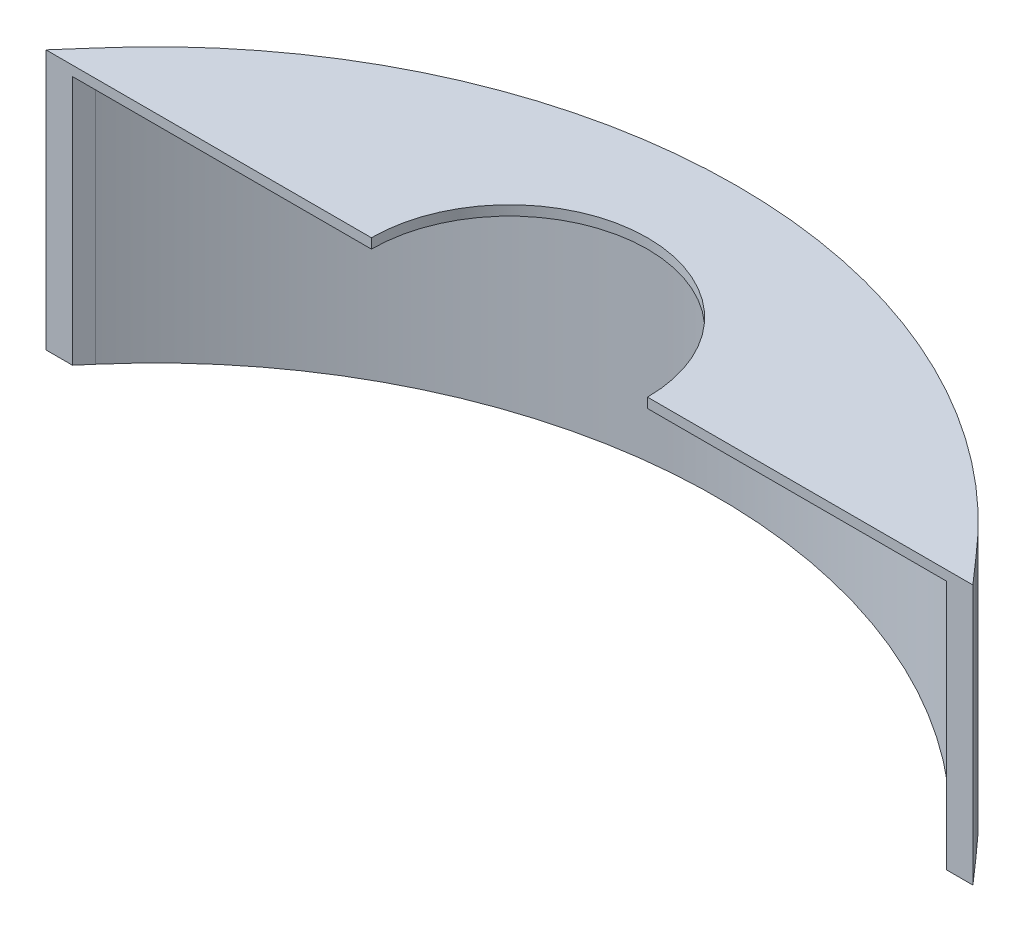
ISO-10303-21;
HEADER;
FILE_DESCRIPTION(('STEP AP214'),'2;1');
FILE_NAME('part.step','',(''),(''),'','','');
FILE_SCHEMA(('AUTOMOTIVE_DESIGN { 1 0 10303 214 1 1 1 1 }'));
ENDSEC;
DATA;
#1=APPLICATION_CONTEXT('core data for automotive mechanical design processes');
#2=APPLICATION_PROTOCOL_DEFINITION('international standard','automotive_design',2000,#1);
#3=PRODUCT_CONTEXT('',#1,'mechanical');
#4=PRODUCT('Part','Part','',(#3));
#5=PRODUCT_RELATED_PRODUCT_CATEGORY('part','',(#4));
#6=PRODUCT_DEFINITION_FORMATION('','',#4);
#7=PRODUCT_DEFINITION_CONTEXT('part definition',#1,'design');
#8=PRODUCT_DEFINITION('design','',#6,#7);
#9=PRODUCT_DEFINITION_SHAPE('','',#8);
#10=(LENGTH_UNIT() NAMED_UNIT(*) SI_UNIT(.MILLI.,.METRE.));
#11=(NAMED_UNIT(*) PLANE_ANGLE_UNIT() SI_UNIT($,.RADIAN.));
#12=(NAMED_UNIT(*) SI_UNIT($,.STERADIAN.) SOLID_ANGLE_UNIT());
#13=UNCERTAINTY_MEASURE_WITH_UNIT(LENGTH_MEASURE(1.E-05),#10,'distance_accuracy_value','');
#14=(GEOMETRIC_REPRESENTATION_CONTEXT(3) GLOBAL_UNCERTAINTY_ASSIGNED_CONTEXT((#13)) GLOBAL_UNIT_ASSIGNED_CONTEXT((#10,
#11,#12)) REPRESENTATION_CONTEXT('',''));
#15=CARTESIAN_POINT('',(0.,0.,0.));
#16=DIRECTION('',(0.,0.,1.));
#17=DIRECTION('',(1.,0.,0.));
#18=AXIS2_PLACEMENT_3D('',#15,#16,#17);
#19=CARTESIAN_POINT('',(117.906734545022,63.4,-5.43103106208609));
#20=DIRECTION('',(0.,0.,-1.));
#21=DIRECTION('',(-1.,0.,0.));
#22=AXIS2_PLACEMENT_3D('',#19,#20,#21);
#23=PLANE('',#22);
#24=DIRECTION('',(1.,0.,0.));
#25=VECTOR('',#24,1.);
#26=CARTESIAN_POINT('',(-113.772816425441,63.4,-5.43103106208609));
#27=LINE('',#26,#25);
#28=CARTESIAN_POINT('',(-107.051707318466,63.4,-5.43103106208609));
#29=VERTEX_POINT('',#28);
#30=CARTESIAN_POINT('',(-31.2683534004412,63.4,-5.43103106208609));
#31=VERTEX_POINT('',#30);
#32=EDGE_CURVE('E131',#29,#31,#27,.T.);
#33=ORIENTED_EDGE('',*,*,#32,.T.);
#34=DIRECTION('',(0.,1.,0.));
#35=VECTOR('',#34,1.);
#36=CARTESIAN_POINT('',(-31.2683534004412,0.,-5.43103106208609));
#37=LINE('',#36,#35);
#38=CARTESIAN_POINT('',(-31.2683534004412,65.9,-5.43103106208609));
#39=VERTEX_POINT('',#38);
#40=EDGE_CURVE('E47',#31,#39,#37,.T.);
#41=ORIENTED_EDGE('',*,*,#40,.T.);
#42=DIRECTION('',(1.,0.,0.));
#43=VECTOR('',#42,1.);
#44=CARTESIAN_POINT('',(-113.772816425441,65.9,-5.43103106208609));
#45=LINE('',#44,#43);
#46=CARTESIAN_POINT('',(-113.772816425441,65.9,-5.43103106208609));
#47=VERTEX_POINT('',#46);
#48=EDGE_CURVE('E124',#47,#39,#45,.T.);
#49=ORIENTED_EDGE('',*,*,#48,.F.);
#50=DIRECTION('',(0.,-1.,0.));
#51=VECTOR('',#50,1.);
#52=CARTESIAN_POINT('',(-113.772816425441,63.4,-5.43103106208609));
#53=LINE('',#52,#51);
#54=CARTESIAN_POINT('',(-113.772816425441,0.,-5.43103106208609));
#55=VERTEX_POINT('',#54);
#56=EDGE_CURVE('E151',#47,#55,#53,.T.);
#57=ORIENTED_EDGE('',*,*,#56,.T.);
#58=DIRECTION('',(1.,0.,0.));
#59=VECTOR('',#58,1.);
#60=CARTESIAN_POINT('',(-113.772816425441,0.,-5.43103106208609));
#61=LINE('',#60,#59);
#62=CARTESIAN_POINT('',(-107.051707318466,0.,-5.43103106208609));
#63=VERTEX_POINT('',#62);
#64=EDGE_CURVE('E139',#55,#63,#61,.T.);
#65=ORIENTED_EDGE('',*,*,#64,.T.);
#66=DIRECTION('',(0.,-1.,0.));
#67=VECTOR('',#66,1.);
#68=CARTESIAN_POINT('',(-107.051707318466,298.337473293499,-5.43103106208609));
#69=LINE('',#68,#67);
#70=EDGE_CURVE('E55',#29,#63,#69,.T.);
#71=ORIENTED_EDGE('',*,*,#70,.F.);
#72=EDGE_LOOP('',(#33,#41,#49,#57,#65,#71));
#73=FACE_BOUND('',#72,.T.);
#74=ADVANCED_FACE('F33',(#73),#23,.F.);
#75=CARTESIAN_POINT('',(38.7316465995588,65.9,-5.43103106208609));
#76=VERTEX_POINT('',#75);
#77=CARTESIAN_POINT('',(121.236109624559,65.9,-5.43103106208609));
#78=VERTEX_POINT('',#77);
#79=EDGE_CURVE('E120',#76,#78,#45,.T.);
#80=ORIENTED_EDGE('',*,*,#79,.F.);
#81=DIRECTION('',(0.,1.,0.));
#82=VECTOR('',#81,1.);
#83=CARTESIAN_POINT('',(38.7316465995588,0.,-5.43103106208609));
#84=LINE('',#83,#82);
#85=CARTESIAN_POINT('',(38.7316465995588,63.4,-5.43103106208609));
#86=VERTEX_POINT('',#85);
#87=EDGE_CURVE('E108',#76,#86,#84,.F.);
#88=ORIENTED_EDGE('',*,*,#87,.T.);
#89=CARTESIAN_POINT('',(114.515000517584,63.4,-5.43103106208609));
#90=VERTEX_POINT('',#89);
#91=EDGE_CURVE('E141',#86,#90,#27,.T.);
#92=ORIENTED_EDGE('',*,*,#91,.T.);
#93=DIRECTION('',(0.,-1.,0.));
#94=VECTOR('',#93,1.);
#95=CARTESIAN_POINT('',(114.515000517584,298.337473293499,-5.43103106208609));
#96=LINE('',#95,#94);
#97=CARTESIAN_POINT('',(114.515000517584,0.,-5.43103106208609));
#98=VERTEX_POINT('',#97);
#99=EDGE_CURVE('E198',#90,#98,#96,.T.);
#100=ORIENTED_EDGE('',*,*,#99,.T.);
#101=DIRECTION('',(1.,0.,0.));
#102=VECTOR('',#101,1.);
#103=CARTESIAN_POINT('',(117.906734545022,0.,-5.43103106208609));
#104=LINE('',#103,#102);
#105=CARTESIAN_POINT('',(121.236109624559,0.,-5.43103106208609));
#106=VERTEX_POINT('',#105);
#107=EDGE_CURVE('E143',#98,#106,#104,.T.);
#108=ORIENTED_EDGE('',*,*,#107,.T.);
#109=DIRECTION('',(0.,-1.,0.));
#110=VECTOR('',#109,1.);
#111=CARTESIAN_POINT('',(121.236109624559,63.4,-5.43103106208609));
#112=LINE('',#111,#110);
#113=EDGE_CURVE('E41',#78,#106,#112,.T.);
#114=ORIENTED_EDGE('',*,*,#113,.F.);
#115=EDGE_LOOP('',(#80,#88,#92,#100,#108,#114));
#116=FACE_BOUND('',#115,.T.);
#117=ADVANCED_FACE('F35',(#116),#23,.F.);
#118=CARTESIAN_POINT('',(115.627443521375,63.4,-11.807033697427));
#119=DIRECTION('',(-0.750842935158534,0.,0.660480799662275));
#120=DIRECTION('',(0.660480799662275,0.,0.750842935158534));
#121=AXIS2_PLACEMENT_3D('',#118,#119,#120);
#122=PLANE('',#121);
#123=DIRECTION('',(-0.660480799662275,0.,-0.750842935158534));
#124=VECTOR('',#123,1.);
#125=CARTESIAN_POINT('',(115.627443521375,0.,-11.807033697427));
#126=LINE('',#125,#124);
#127=CARTESIAN_POINT('',(115.627443521375,0.,-11.807033697427));
#128=VERTEX_POINT('',#127);
#129=EDGE_CURVE('E145',#106,#128,#126,.T.);
#130=ORIENTED_EDGE('',*,*,#129,.T.);
#131=DIRECTION('',(0.,-1.,0.));
#132=VECTOR('',#131,1.);
#133=CARTESIAN_POINT('',(115.627443521375,63.4,-11.807033697427));
#134=LINE('',#133,#132);
#135=CARTESIAN_POINT('',(115.627443521375,65.9,-11.807033697427));
#136=VERTEX_POINT('',#135);
#137=EDGE_CURVE('E157',#136,#128,#134,.T.);
#138=ORIENTED_EDGE('',*,*,#137,.F.);
#139=DIRECTION('',(-0.660480799662276,0.,-0.750842935158533));
#140=VECTOR('',#139,1.);
#141=CARTESIAN_POINT('',(121.236109624559,65.9,-5.43103106208609));
#142=LINE('',#141,#140);
#143=EDGE_CURVE('E130',#78,#136,#142,.T.);
#144=ORIENTED_EDGE('',*,*,#143,.F.);
#145=ORIENTED_EDGE('',*,*,#113,.T.);
#146=EDGE_LOOP('',(#130,#138,#144,#145));
#147=FACE_BOUND('',#146,.T.);
#148=ADVANCED_FACE('F161',(#147),#122,.F.);
#149=CARTESIAN_POINT('',(3.73164659955884,63.4,84.383478424426));
#150=DIRECTION('',(0.,-1.,0.));
#151=DIRECTION('',(0.,0.,-1.));
#152=AXIS2_PLACEMENT_3D('',#149,#150,#151);
#153=CYLINDRICAL_SURFACE('',#152,147.557731044607);
#154=CARTESIAN_POINT('',(3.73164659955884,0.,84.383478424426));
#155=DIRECTION('',(0.,1.,0.));
#156=DIRECTION('',(0.,0.,-1.));
#157=AXIS2_PLACEMENT_3D('',#154,#155,#156);
#158=CIRCLE('',#157,147.557731044607);
#159=CARTESIAN_POINT('',(-108.164150322257,0.,-11.8070336974269));
#160=VERTEX_POINT('',#159);
#161=EDGE_CURVE('E147',#128,#160,#158,.T.);
#162=ORIENTED_EDGE('',*,*,#161,.T.);
#163=DIRECTION('',(0.,-1.,0.));
#164=VECTOR('',#163,1.);
#165=CARTESIAN_POINT('',(-108.164150322257,63.4,-11.8070336974269));
#166=LINE('',#165,#164);
#167=CARTESIAN_POINT('',(-108.164150322257,65.9,-11.8070336974269));
#168=VERTEX_POINT('',#167);
#169=EDGE_CURVE('E154',#168,#160,#166,.T.);
#170=ORIENTED_EDGE('',*,*,#169,.F.);
#171=CARTESIAN_POINT('',(3.73164659955883,65.9,84.3834784244277));
#172=DIRECTION('',(0.,1.,0.));
#173=DIRECTION('',(0.,0.,-1.));
#174=AXIS2_PLACEMENT_3D('',#171,#172,#173);
#175=CIRCLE('',#174,147.557731044608);
#176=EDGE_CURVE('E136',#136,#168,#175,.T.);
#177=ORIENTED_EDGE('',*,*,#176,.F.);
#178=ORIENTED_EDGE('',*,*,#137,.T.);
#179=EDGE_LOOP('',(#162,#170,#177,#178));
#180=FACE_BOUND('',#179,.T.);
#181=ADVANCED_FACE('F170',(#180),#153,.T.);
#182=CARTESIAN_POINT('',(-108.164150322257,63.4,-11.8070336974269));
#183=DIRECTION('',(0.75084293515853,0.,0.660480799662279));
#184=DIRECTION('',(0.660480799662279,0.,-0.75084293515853));
#185=AXIS2_PLACEMENT_3D('',#182,#183,#184);
#186=PLANE('',#185);
#187=DIRECTION('',(-0.660480799662279,0.,0.75084293515853));
#188=VECTOR('',#187,1.);
#189=CARTESIAN_POINT('',(-108.164150322257,0.,-11.8070336974269));
#190=LINE('',#189,#188);
#191=EDGE_CURVE('E149',#160,#55,#190,.T.);
#192=ORIENTED_EDGE('',*,*,#191,.T.);
#193=ORIENTED_EDGE('',*,*,#56,.F.);
#194=DIRECTION('',(-0.660480799662279,0.,0.75084293515853));
#195=VECTOR('',#194,1.);
#196=CARTESIAN_POINT('',(-113.772816425441,65.9,-5.43103106208609));
#197=LINE('',#196,#195);
#198=EDGE_CURVE('E128',#168,#47,#197,.T.);
#199=ORIENTED_EDGE('',*,*,#198,.F.);
#200=ORIENTED_EDGE('',*,*,#169,.T.);
#201=EDGE_LOOP('',(#192,#193,#199,#200));
#202=FACE_BOUND('',#201,.T.);
#203=ADVANCED_FACE('F174',(#202),#186,.F.);
#204=CARTESIAN_POINT('',(3.73164659955884,0.,84.383478424426));
#205=DIRECTION('',(0.,-1.,0.));
#206=DIRECTION('',(0.,0.,-1.));
#207=AXIS2_PLACEMENT_3D('',#204,#205,#206);
#208=PLANE('',#207);
#209=ORIENTED_EDGE('',*,*,#107,.F.);
#210=DIRECTION('',(0.651883919879313,0.,0.758318768726438));
#211=VECTOR('',#210,1.);
#212=CARTESIAN_POINT('',(111.835849677743,0.,-8.54761409803047));
#213=LINE('',#212,#211);
#214=CARTESIAN_POINT('',(111.835849677743,0.,-8.54761409803047));
#215=VERTEX_POINT('',#214);
#216=EDGE_CURVE('E179',#215,#98,#213,.T.);
#217=ORIENTED_EDGE('',*,*,#216,.F.);
#218=CARTESIAN_POINT('',(3.73164659955883,0.,84.3834784244322));
#219=DIRECTION('',(0.,-1.,0.));
#220=DIRECTION('',(0.,0.,-1.));
#221=AXIS2_PLACEMENT_3D('',#218,#219,#220);
#222=CIRCLE('',#221,142.557731044611);
#223=CARTESIAN_POINT('',(-104.372556478625,0.,-8.54761409803034));
#224=VERTEX_POINT('',#223);
#225=EDGE_CURVE('E192',#224,#215,#222,.T.);
#226=ORIENTED_EDGE('',*,*,#225,.F.);
#227=DIRECTION('',(-0.651883919879316,0.,0.758318768726436));
#228=VECTOR('',#227,1.);
#229=CARTESIAN_POINT('',(-104.372556478625,0.,-8.54761409803038));
#230=LINE('',#229,#228);
#231=EDGE_CURVE('E176',#224,#63,#230,.T.);
#232=ORIENTED_EDGE('',*,*,#231,.T.);
#233=ORIENTED_EDGE('',*,*,#64,.F.);
#234=ORIENTED_EDGE('',*,*,#191,.F.);
#235=ORIENTED_EDGE('',*,*,#161,.F.);
#236=ORIENTED_EDGE('',*,*,#129,.F.);
#237=EDGE_LOOP('',(#209,#217,#226,#232,#233,#234,#235,#236));
#238=FACE_BOUND('',#237,.T.);
#239=ADVANCED_FACE('F164',(#238),#208,.T.);
#240=CARTESIAN_POINT('',(3.73164659955883,65.9,84.3834784244277));
#241=DIRECTION('',(0.,-1.,0.));
#242=DIRECTION('',(0.,0.,-1.));
#243=AXIS2_PLACEMENT_3D('',#240,#241,#242);
#244=PLANE('',#243);
#245=ORIENTED_EDGE('',*,*,#48,.T.);
#246=CARTESIAN_POINT('',(3.73164659955881,65.9,-5.43103106208609));
#247=DIRECTION('',(0.,1.,0.));
#248=DIRECTION('',(0.,0.,1.));
#249=AXIS2_PLACEMENT_3D('',#246,#247,#248);
#250=CIRCLE('',#249,35.);
#251=EDGE_CURVE('E111',#76,#39,#250,.T.);
#252=ORIENTED_EDGE('',*,*,#251,.F.);
#253=ORIENTED_EDGE('',*,*,#79,.T.);
#254=ORIENTED_EDGE('',*,*,#143,.T.);
#255=ORIENTED_EDGE('',*,*,#176,.T.);
#256=ORIENTED_EDGE('',*,*,#198,.T.);
#257=EDGE_LOOP('',(#245,#252,#253,#254,#255,#256));
#258=FACE_BOUND('',#257,.T.);
#259=ADVANCED_FACE('F118',(#258),#244,.F.);
#260=CARTESIAN_POINT('',(3.73164659955883,63.4,84.3834784244277));
#261=DIRECTION('',(0.,-1.,0.));
#262=DIRECTION('',(0.,0.,-1.));
#263=AXIS2_PLACEMENT_3D('',#260,#261,#262);
#264=PLANE('',#263);
#265=CARTESIAN_POINT('',(3.73164659955881,63.4,-5.43103106208609));
#266=DIRECTION('',(0.,-1.,0.));
#267=DIRECTION('',(0.,0.,-1.));
#268=AXIS2_PLACEMENT_3D('',#265,#266,#267);
#269=CIRCLE('',#268,35.);
#270=EDGE_CURVE('E11',#31,#86,#269,.T.);
#271=ORIENTED_EDGE('',*,*,#270,.F.);
#272=ORIENTED_EDGE('',*,*,#32,.F.);
#273=DIRECTION('',(0.651883919879316,0.,-0.758318768726436));
#274=VECTOR('',#273,1.);
#275=CARTESIAN_POINT('',(-104.372556478625,63.4,-8.54761409803038));
#276=LINE('',#275,#274);
#277=CARTESIAN_POINT('',(-104.372556478625,63.4,-8.54761409803034));
#278=VERTEX_POINT('',#277);
#279=EDGE_CURVE('E187',#29,#278,#276,.T.);
#280=ORIENTED_EDGE('',*,*,#279,.T.);
#281=CARTESIAN_POINT('',(3.73164659955883,63.4,84.3834784244322));
#282=DIRECTION('',(0.,-1.,0.));
#283=DIRECTION('',(0.,0.,-1.));
#284=AXIS2_PLACEMENT_3D('',#281,#282,#283);
#285=CIRCLE('',#284,142.557731044611);
#286=CARTESIAN_POINT('',(111.835849677743,63.4,-8.54761409803047));
#287=VERTEX_POINT('',#286);
#288=EDGE_CURVE('E184',#287,#278,#285,.F.);
#289=ORIENTED_EDGE('',*,*,#288,.F.);
#290=DIRECTION('',(-0.651883919879313,0.,-0.758318768726438));
#291=VECTOR('',#290,1.);
#292=CARTESIAN_POINT('',(111.835849677743,63.4,-8.54761409803047));
#293=LINE('',#292,#291);
#294=EDGE_CURVE('E182',#90,#287,#293,.T.);
#295=ORIENTED_EDGE('',*,*,#294,.F.);
#296=ORIENTED_EDGE('',*,*,#91,.F.);
#297=EDGE_LOOP('',(#271,#272,#280,#289,#295,#296));
#298=FACE_BOUND('',#297,.T.);
#299=ADVANCED_FACE('F209',(#298),#264,.T.);
#300=CARTESIAN_POINT('',(-104.372556478625,298.337473293499,-8.54761409803038));
#301=DIRECTION('',(0.758318768726436,0.,0.651883919879316));
#302=DIRECTION('',(0.651883919879316,0.,-0.758318768726436));
#303=AXIS2_PLACEMENT_3D('',#300,#301,#302);
#304=PLANE('',#303);
#305=ORIENTED_EDGE('',*,*,#279,.F.);
#306=ORIENTED_EDGE('',*,*,#70,.T.);
#307=ORIENTED_EDGE('',*,*,#231,.F.);
#308=DIRECTION('',(0.,-1.,0.));
#309=VECTOR('',#308,1.);
#310=CARTESIAN_POINT('',(-104.372556478625,298.337473293499,-8.54761409803034));
#311=LINE('',#310,#309);
#312=EDGE_CURVE('E185',#278,#224,#311,.T.);
#313=ORIENTED_EDGE('',*,*,#312,.F.);
#314=EDGE_LOOP('',(#305,#306,#307,#313));
#315=FACE_BOUND('',#314,.T.);
#316=ADVANCED_FACE('F201',(#315),#304,.T.);
#317=CARTESIAN_POINT('',(3.73164659955883,298.337473293499,84.3834784244322));
#318=DIRECTION('',(0.,-1.,0.));
#319=DIRECTION('',(0.,0.,-1.));
#320=AXIS2_PLACEMENT_3D('',#317,#318,#319);
#321=CYLINDRICAL_SURFACE('',#320,142.557731044611);
#322=DIRECTION('',(0.,-1.,0.));
#323=VECTOR('',#322,1.);
#324=CARTESIAN_POINT('',(111.835849677743,298.337473293499,-8.54761409803047));
#325=LINE('',#324,#323);
#326=EDGE_CURVE('E196',#287,#215,#325,.T.);
#327=ORIENTED_EDGE('',*,*,#326,.F.);
#328=ORIENTED_EDGE('',*,*,#288,.T.);
#329=ORIENTED_EDGE('',*,*,#312,.T.);
#330=ORIENTED_EDGE('',*,*,#225,.T.);
#331=EDGE_LOOP('',(#327,#328,#329,#330));
#332=FACE_BOUND('',#331,.T.);
#333=ADVANCED_FACE('F206',(#332),#321,.F.);
#334=CARTESIAN_POINT('',(111.835849677743,298.337473293499,-8.54761409803047));
#335=DIRECTION('',(0.758318768726438,0.,-0.651883919879313));
#336=DIRECTION('',(-0.651883919879313,0.,-0.758318768726438));
#337=AXIS2_PLACEMENT_3D('',#334,#335,#336);
#338=PLANE('',#337);
#339=ORIENTED_EDGE('',*,*,#99,.F.);
#340=ORIENTED_EDGE('',*,*,#294,.T.);
#341=ORIENTED_EDGE('',*,*,#326,.T.);
#342=ORIENTED_EDGE('',*,*,#216,.T.);
#343=EDGE_LOOP('',(#339,#340,#341,#342));
#344=FACE_BOUND('',#343,.T.);
#345=ADVANCED_FACE('F213',(#344),#338,.F.);
#346=CARTESIAN_POINT('',(3.73164659955881,0.,-5.43103106208609));
#347=DIRECTION('',(0.,1.,0.));
#348=DIRECTION('',(0.,0.,1.));
#349=AXIS2_PLACEMENT_3D('',#346,#347,#348);
#350=CYLINDRICAL_SURFACE('',#349,35.);
#351=ORIENTED_EDGE('',*,*,#270,.T.);
#352=ORIENTED_EDGE('',*,*,#87,.F.);
#353=ORIENTED_EDGE('',*,*,#251,.T.);
#354=ORIENTED_EDGE('',*,*,#40,.F.);
#355=EDGE_LOOP('',(#351,#352,#353,#354));
#356=FACE_BOUND('',#355,.T.);
#357=ADVANCED_FACE('F110',(#356),#350,.F.);
#358=CLOSED_SHELL('',(#74,#117,#148,#181,#203,#239,#259,#299,#316,#333,#345,#357));
#359=MANIFOLD_SOLID_BREP('B2',#358);
#360=ADVANCED_BREP_SHAPE_REPRESENTATION('',(#18,#359),#14);
#361=SHAPE_DEFINITION_REPRESENTATION(#9,#360);
ENDSEC;
END-ISO-10303-21;
